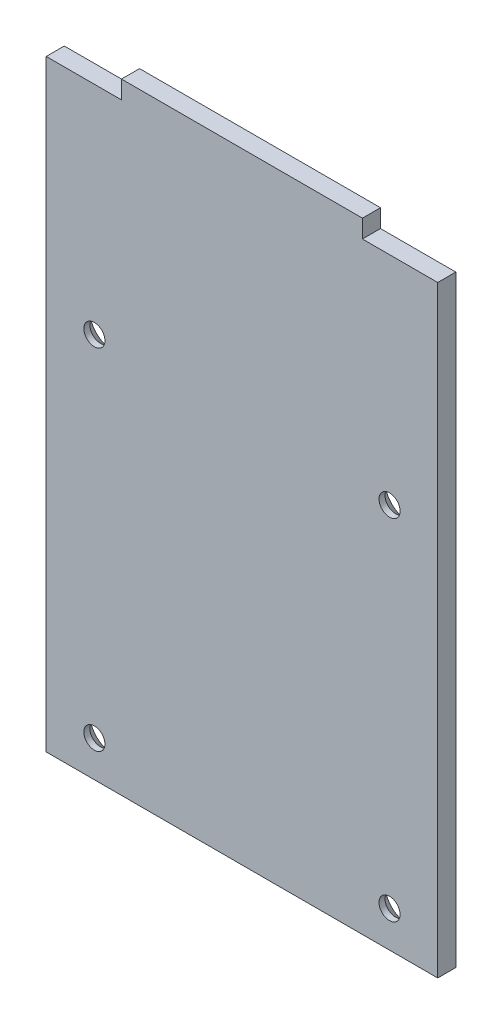
ISO-10303-21;
HEADER;
FILE_DESCRIPTION(('STEP AP214'),'2;1');
FILE_NAME('part.step','',(''),(''),'','','');
FILE_SCHEMA(('AUTOMOTIVE_DESIGN { 1 0 10303 214 1 1 1 1 }'));
ENDSEC;
DATA;
#1=APPLICATION_CONTEXT('core data for automotive mechanical design processes');
#2=APPLICATION_PROTOCOL_DEFINITION('international standard','automotive_design',2000,#1);
#3=PRODUCT_CONTEXT('',#1,'mechanical');
#4=PRODUCT('Part','Part','',(#3));
#5=PRODUCT_RELATED_PRODUCT_CATEGORY('part','',(#4));
#6=PRODUCT_DEFINITION_FORMATION('','',#4);
#7=PRODUCT_DEFINITION_CONTEXT('part definition',#1,'design');
#8=PRODUCT_DEFINITION('design','',#6,#7);
#9=PRODUCT_DEFINITION_SHAPE('','',#8);
#10=(LENGTH_UNIT() NAMED_UNIT(*) SI_UNIT(.MILLI.,.METRE.));
#11=(NAMED_UNIT(*) PLANE_ANGLE_UNIT() SI_UNIT($,.RADIAN.));
#12=(NAMED_UNIT(*) SI_UNIT($,.STERADIAN.) SOLID_ANGLE_UNIT());
#13=UNCERTAINTY_MEASURE_WITH_UNIT(LENGTH_MEASURE(1.E-05),#10,'distance_accuracy_value','');
#14=(GEOMETRIC_REPRESENTATION_CONTEXT(3) GLOBAL_UNCERTAINTY_ASSIGNED_CONTEXT((#13)) GLOBAL_UNIT_ASSIGNED_CONTEXT((#10,
#11,#12)) REPRESENTATION_CONTEXT('',''));
#15=CARTESIAN_POINT('',(0.,0.,0.));
#16=DIRECTION('',(0.,0.,1.));
#17=DIRECTION('',(1.,0.,0.));
#18=AXIS2_PLACEMENT_3D('',#15,#16,#17);
#19=CARTESIAN_POINT('',(0.,50.,3.));
#20=DIRECTION('',(0.,1.,0.));
#21=DIRECTION('',(0.,0.,1.));
#22=AXIS2_PLACEMENT_3D('',#19,#20,#21);
#23=PLANE('',#22);
#24=DIRECTION('',(1.,0.,0.));
#25=VECTOR('',#24,1.);
#26=CARTESIAN_POINT('',(0.,50.,0.));
#27=LINE('',#26,#25);
#28=CARTESIAN_POINT('',(20.,50.,0.));
#29=VERTEX_POINT('',#28);
#30=CARTESIAN_POINT('',(32.5,50.,0.));
#31=VERTEX_POINT('',#30);
#32=EDGE_CURVE('E140',#29,#31,#27,.T.);
#33=ORIENTED_EDGE('',*,*,#32,.F.);
#34=DIRECTION('',(0.,0.,-1.));
#35=VECTOR('',#34,1.);
#36=CARTESIAN_POINT('',(20.,50.,3.));
#37=LINE('',#36,#35);
#38=CARTESIAN_POINT('',(20.,50.,3.));
#39=VERTEX_POINT('',#38);
#40=EDGE_CURVE('E97',#39,#29,#37,.T.);
#41=ORIENTED_EDGE('',*,*,#40,.F.);
#42=DIRECTION('',(1.,0.,0.));
#43=VECTOR('',#42,1.);
#44=CARTESIAN_POINT('',(0.,50.,3.));
#45=LINE('',#44,#43);
#46=CARTESIAN_POINT('',(32.5,50.,3.));
#47=VERTEX_POINT('',#46);
#48=EDGE_CURVE('E135',#39,#47,#45,.T.);
#49=ORIENTED_EDGE('',*,*,#48,.T.);
#50=DIRECTION('',(0.,0.,-1.));
#51=VECTOR('',#50,1.);
#52=CARTESIAN_POINT('',(32.5,50.,3.));
#53=LINE('',#52,#51);
#54=EDGE_CURVE('E92',#47,#31,#53,.T.);
#55=ORIENTED_EDGE('',*,*,#54,.T.);
#56=EDGE_LOOP('',(#33,#41,#49,#55));
#57=FACE_BOUND('',#56,.T.);
#58=ADVANCED_FACE('F39',(#57),#23,.T.);
#59=CARTESIAN_POINT('',(20.,0.,3.));
#60=DIRECTION('',(-1.,0.,0.));
#61=DIRECTION('',(0.,0.,1.));
#62=AXIS2_PLACEMENT_3D('',#59,#60,#61);
#63=PLANE('',#62);
#64=DIRECTION('',(0.,1.,0.));
#65=VECTOR('',#64,1.);
#66=CARTESIAN_POINT('',(20.,0.,0.));
#67=LINE('',#66,#65);
#68=CARTESIAN_POINT('',(20.,53.,0.));
#69=VERTEX_POINT('',#68);
#70=EDGE_CURVE('E143',#29,#69,#67,.T.);
#71=ORIENTED_EDGE('',*,*,#70,.T.);
#72=DIRECTION('',(0.,0.,-1.));
#73=VECTOR('',#72,1.);
#74=CARTESIAN_POINT('',(20.,53.,3.));
#75=LINE('',#74,#73);
#76=CARTESIAN_POINT('',(20.,53.,3.));
#77=VERTEX_POINT('',#76);
#78=EDGE_CURVE('E165',#77,#69,#75,.T.);
#79=ORIENTED_EDGE('',*,*,#78,.F.);
#80=DIRECTION('',(0.,1.,0.));
#81=VECTOR('',#80,1.);
#82=CARTESIAN_POINT('',(20.,0.,3.));
#83=LINE('',#82,#81);
#84=EDGE_CURVE('E237',#39,#77,#83,.T.);
#85=ORIENTED_EDGE('',*,*,#84,.F.);
#86=ORIENTED_EDGE('',*,*,#40,.T.);
#87=EDGE_LOOP('',(#71,#79,#85,#86));
#88=FACE_BOUND('',#87,.T.);
#89=ADVANCED_FACE('F208',(#88),#63,.F.);
#90=CARTESIAN_POINT('',(0.,53.,3.));
#91=DIRECTION('',(0.,1.,0.));
#92=DIRECTION('',(0.,0.,1.));
#93=AXIS2_PLACEMENT_3D('',#90,#91,#92);
#94=PLANE('',#93);
#95=DIRECTION('',(1.,0.,0.));
#96=VECTOR('',#95,1.);
#97=CARTESIAN_POINT('',(0.,53.,0.));
#98=LINE('',#97,#96);
#99=CARTESIAN_POINT('',(-20.,53.,0.));
#100=VERTEX_POINT('',#99);
#101=EDGE_CURVE('E148',#100,#69,#98,.T.);
#102=ORIENTED_EDGE('',*,*,#101,.F.);
#103=DIRECTION('',(0.,0.,-1.));
#104=VECTOR('',#103,1.);
#105=CARTESIAN_POINT('',(-20.,53.,3.));
#106=LINE('',#105,#104);
#107=CARTESIAN_POINT('',(-20.,53.,3.));
#108=VERTEX_POINT('',#107);
#109=EDGE_CURVE('E163',#108,#100,#106,.T.);
#110=ORIENTED_EDGE('',*,*,#109,.F.);
#111=DIRECTION('',(1.,0.,0.));
#112=VECTOR('',#111,1.);
#113=CARTESIAN_POINT('',(0.,53.,3.));
#114=LINE('',#113,#112);
#115=EDGE_CURVE('E236',#108,#77,#114,.T.);
#116=ORIENTED_EDGE('',*,*,#115,.T.);
#117=ORIENTED_EDGE('',*,*,#78,.T.);
#118=EDGE_LOOP('',(#102,#110,#116,#117));
#119=FACE_BOUND('',#118,.T.);
#120=ADVANCED_FACE('F214',(#119),#94,.T.);
#121=CARTESIAN_POINT('',(-20.,0.,3.));
#122=DIRECTION('',(-1.,0.,0.));
#123=DIRECTION('',(0.,0.,1.));
#124=AXIS2_PLACEMENT_3D('',#121,#122,#123);
#125=PLANE('',#124);
#126=DIRECTION('',(0.,1.,0.));
#127=VECTOR('',#126,1.);
#128=CARTESIAN_POINT('',(-20.,0.,0.));
#129=LINE('',#128,#127);
#130=CARTESIAN_POINT('',(-20.,50.,0.));
#131=VERTEX_POINT('',#130);
#132=EDGE_CURVE('E151',#131,#100,#129,.T.);
#133=ORIENTED_EDGE('',*,*,#132,.F.);
#134=DIRECTION('',(0.,0.,-1.));
#135=VECTOR('',#134,1.);
#136=CARTESIAN_POINT('',(-20.,50.,3.));
#137=LINE('',#136,#135);
#138=CARTESIAN_POINT('',(-20.,50.,3.));
#139=VERTEX_POINT('',#138);
#140=EDGE_CURVE('E161',#139,#131,#137,.T.);
#141=ORIENTED_EDGE('',*,*,#140,.F.);
#142=DIRECTION('',(0.,1.,0.));
#143=VECTOR('',#142,1.);
#144=CARTESIAN_POINT('',(-20.,0.,3.));
#145=LINE('',#144,#143);
#146=EDGE_CURVE('E133',#139,#108,#145,.T.);
#147=ORIENTED_EDGE('',*,*,#146,.T.);
#148=ORIENTED_EDGE('',*,*,#109,.T.);
#149=EDGE_LOOP('',(#133,#141,#147,#148));
#150=FACE_BOUND('',#149,.T.);
#151=ADVANCED_FACE('F220',(#150),#125,.T.);
#152=CARTESIAN_POINT('',(-32.5,50.,0.));
#153=VERTEX_POINT('',#152);
#154=EDGE_CURVE('E145',#153,#131,#27,.T.);
#155=ORIENTED_EDGE('',*,*,#154,.F.);
#156=DIRECTION('',(0.,0.,-1.));
#157=VECTOR('',#156,1.);
#158=CARTESIAN_POINT('',(-32.5,50.,3.));
#159=LINE('',#158,#157);
#160=CARTESIAN_POINT('',(-32.5,50.,3.));
#161=VERTEX_POINT('',#160);
#162=EDGE_CURVE('E121',#161,#153,#159,.T.);
#163=ORIENTED_EDGE('',*,*,#162,.F.);
#164=EDGE_CURVE('E131',#161,#139,#45,.T.);
#165=ORIENTED_EDGE('',*,*,#164,.T.);
#166=ORIENTED_EDGE('',*,*,#140,.T.);
#167=EDGE_LOOP('',(#155,#163,#165,#166));
#168=FACE_BOUND('',#167,.T.);
#169=ADVANCED_FACE('F210',(#168),#23,.T.);
#170=CARTESIAN_POINT('',(-32.5,0.,3.));
#171=DIRECTION('',(-1.,0.,0.));
#172=DIRECTION('',(0.,0.,1.));
#173=AXIS2_PLACEMENT_3D('',#170,#171,#172);
#174=PLANE('',#173);
#175=DIRECTION('',(0.,1.,0.));
#176=VECTOR('',#175,1.);
#177=CARTESIAN_POINT('',(-32.5,0.,0.));
#178=LINE('',#177,#176);
#179=CARTESIAN_POINT('',(-32.5,-50.,0.));
#180=VERTEX_POINT('',#179);
#181=EDGE_CURVE('E120',#180,#153,#178,.T.);
#182=ORIENTED_EDGE('',*,*,#181,.F.);
#183=DIRECTION('',(0.,0.,-1.));
#184=VECTOR('',#183,1.);
#185=CARTESIAN_POINT('',(-32.5,-50.,3.));
#186=LINE('',#185,#184);
#187=CARTESIAN_POINT('',(-32.5,-50.,3.));
#188=VERTEX_POINT('',#187);
#189=EDGE_CURVE('E114',#188,#180,#186,.T.);
#190=ORIENTED_EDGE('',*,*,#189,.F.);
#191=DIRECTION('',(0.,1.,0.));
#192=VECTOR('',#191,1.);
#193=CARTESIAN_POINT('',(-32.5,0.,3.));
#194=LINE('',#193,#192);
#195=EDGE_CURVE('E118',#188,#161,#194,.T.);
#196=ORIENTED_EDGE('',*,*,#195,.T.);
#197=ORIENTED_EDGE('',*,*,#162,.T.);
#198=EDGE_LOOP('',(#182,#190,#196,#197));
#199=FACE_BOUND('',#198,.T.);
#200=ADVANCED_FACE('F116',(#199),#174,.T.);
#201=CARTESIAN_POINT('',(0.,-50.,3.));
#202=DIRECTION('',(0.,1.,0.));
#203=DIRECTION('',(0.,0.,1.));
#204=AXIS2_PLACEMENT_3D('',#201,#202,#203);
#205=PLANE('',#204);
#206=DIRECTION('',(1.,0.,0.));
#207=VECTOR('',#206,1.);
#208=CARTESIAN_POINT('',(0.,-50.,0.));
#209=LINE('',#208,#207);
#210=CARTESIAN_POINT('',(32.5,-50.,0.));
#211=VERTEX_POINT('',#210);
#212=EDGE_CURVE('E85',#180,#211,#209,.T.);
#213=ORIENTED_EDGE('',*,*,#212,.T.);
#214=DIRECTION('',(0.,0.,-1.));
#215=VECTOR('',#214,1.);
#216=CARTESIAN_POINT('',(32.5,-50.,3.));
#217=LINE('',#216,#215);
#218=CARTESIAN_POINT('',(32.5,-50.,3.));
#219=VERTEX_POINT('',#218);
#220=EDGE_CURVE('E122',#219,#211,#217,.T.);
#221=ORIENTED_EDGE('',*,*,#220,.F.);
#222=DIRECTION('',(1.,0.,0.));
#223=VECTOR('',#222,1.);
#224=CARTESIAN_POINT('',(0.,-50.,3.));
#225=LINE('',#224,#223);
#226=EDGE_CURVE('E124',#188,#219,#225,.T.);
#227=ORIENTED_EDGE('',*,*,#226,.F.);
#228=ORIENTED_EDGE('',*,*,#189,.T.);
#229=EDGE_LOOP('',(#213,#221,#227,#228));
#230=FACE_BOUND('',#229,.T.);
#231=ADVANCED_FACE('F125',(#230),#205,.F.);
#232=CARTESIAN_POINT('',(32.5,0.,3.));
#233=DIRECTION('',(-1.,0.,0.));
#234=DIRECTION('',(0.,0.,1.));
#235=AXIS2_PLACEMENT_3D('',#232,#233,#234);
#236=PLANE('',#235);
#237=DIRECTION('',(0.,1.,0.));
#238=VECTOR('',#237,1.);
#239=CARTESIAN_POINT('',(32.5,0.,0.));
#240=LINE('',#239,#238);
#241=EDGE_CURVE('E156',#211,#31,#240,.T.);
#242=ORIENTED_EDGE('',*,*,#241,.T.);
#243=ORIENTED_EDGE('',*,*,#54,.F.);
#244=DIRECTION('',(0.,1.,0.));
#245=VECTOR('',#244,1.);
#246=CARTESIAN_POINT('',(32.5,0.,3.));
#247=LINE('',#246,#245);
#248=EDGE_CURVE('E57',#219,#47,#247,.T.);
#249=ORIENTED_EDGE('',*,*,#248,.F.);
#250=ORIENTED_EDGE('',*,*,#220,.T.);
#251=EDGE_LOOP('',(#242,#243,#249,#250));
#252=FACE_BOUND('',#251,.T.);
#253=ADVANCED_FACE('F254',(#252),#236,.F.);
#254=CARTESIAN_POINT('',(0.,0.,3.));
#255=DIRECTION('',(0.,0.,1.));
#256=DIRECTION('',(1.,0.,0.));
#257=AXIS2_PLACEMENT_3D('',#254,#255,#256);
#258=PLANE('',#257);
#259=CARTESIAN_POINT('',(-24.5,-44.,3.));
#260=DIRECTION('',(0.,0.,1.));
#261=DIRECTION('',(1.,0.,0.));
#262=AXIS2_PLACEMENT_3D('',#259,#260,#261);
#263=CIRCLE('',#262,1.75);
#264=CARTESIAN_POINT('',(-22.75,-44.,3.));
#265=VERTEX_POINT('',#264);
#266=EDGE_CURVE('E243',#265,#265,#263,.T.);
#267=ORIENTED_EDGE('',*,*,#266,.F.);
#268=EDGE_LOOP('',(#267));
#269=FACE_BOUND('',#268,.T.);
#270=CARTESIAN_POINT('',(24.5,-44.,3.));
#271=DIRECTION('',(0.,0.,1.));
#272=DIRECTION('',(1.,0.,0.));
#273=AXIS2_PLACEMENT_3D('',#270,#271,#272);
#274=CIRCLE('',#273,1.75);
#275=CARTESIAN_POINT('',(26.25,-44.,3.));
#276=VERTEX_POINT('',#275);
#277=EDGE_CURVE('E246',#276,#276,#274,.T.);
#278=ORIENTED_EDGE('',*,*,#277,.F.);
#279=EDGE_LOOP('',(#278));
#280=FACE_BOUND('',#279,.T.);
#281=CARTESIAN_POINT('',(24.5,14.,3.));
#282=DIRECTION('',(0.,0.,1.));
#283=DIRECTION('',(1.,0.,0.));
#284=AXIS2_PLACEMENT_3D('',#281,#282,#283);
#285=CIRCLE('',#284,1.75);
#286=CARTESIAN_POINT('',(26.25,14.,3.));
#287=VERTEX_POINT('',#286);
#288=EDGE_CURVE('E242',#287,#287,#285,.T.);
#289=ORIENTED_EDGE('',*,*,#288,.F.);
#290=EDGE_LOOP('',(#289));
#291=FACE_BOUND('',#290,.T.);
#292=CARTESIAN_POINT('',(-24.5,14.,3.));
#293=DIRECTION('',(0.,0.,1.));
#294=DIRECTION('',(1.,0.,0.));
#295=AXIS2_PLACEMENT_3D('',#292,#293,#294);
#296=CIRCLE('',#295,1.75);
#297=CARTESIAN_POINT('',(-22.75,14.,3.));
#298=VERTEX_POINT('',#297);
#299=EDGE_CURVE('E144',#298,#298,#296,.T.);
#300=ORIENTED_EDGE('',*,*,#299,.F.);
#301=EDGE_LOOP('',(#300));
#302=FACE_BOUND('',#301,.T.);
#303=ORIENTED_EDGE('',*,*,#48,.F.);
#304=ORIENTED_EDGE('',*,*,#84,.T.);
#305=ORIENTED_EDGE('',*,*,#115,.F.);
#306=ORIENTED_EDGE('',*,*,#146,.F.);
#307=ORIENTED_EDGE('',*,*,#164,.F.);
#308=ORIENTED_EDGE('',*,*,#195,.F.);
#309=ORIENTED_EDGE('',*,*,#226,.T.);
#310=ORIENTED_EDGE('',*,*,#248,.T.);
#311=EDGE_LOOP('',(#303,#304,#305,#306,#307,#308,#309,#310));
#312=FACE_BOUND('',#311,.T.);
#313=ADVANCED_FACE('F128',(#269,#280,#291,#302,#312),#258,.T.);
#314=CARTESIAN_POINT('',(0.,0.,0.));
#315=DIRECTION('',(0.,0.,1.));
#316=DIRECTION('',(1.,0.,0.));
#317=AXIS2_PLACEMENT_3D('',#314,#315,#316);
#318=PLANE('',#317);
#319=CARTESIAN_POINT('',(-24.5,-44.,0.));
#320=DIRECTION('',(0.,0.,1.));
#321=DIRECTION('',(1.,0.,0.));
#322=AXIS2_PLACEMENT_3D('',#319,#320,#321);
#323=CIRCLE('',#322,3.74999999999999);
#324=CARTESIAN_POINT('',(-20.75,-44.,0.));
#325=VERTEX_POINT('',#324);
#326=EDGE_CURVE('E177',#325,#325,#323,.T.);
#327=ORIENTED_EDGE('',*,*,#326,.T.);
#328=EDGE_LOOP('',(#327));
#329=FACE_BOUND('',#328,.T.);
#330=CARTESIAN_POINT('',(-24.5,14.,0.));
#331=DIRECTION('',(0.,0.,1.));
#332=DIRECTION('',(1.,0.,0.));
#333=AXIS2_PLACEMENT_3D('',#330,#331,#332);
#334=CIRCLE('',#333,3.75);
#335=CARTESIAN_POINT('',(-20.75,14.,0.));
#336=VERTEX_POINT('',#335);
#337=EDGE_CURVE('E174',#336,#336,#334,.T.);
#338=ORIENTED_EDGE('',*,*,#337,.T.);
#339=EDGE_LOOP('',(#338));
#340=FACE_BOUND('',#339,.T.);
#341=CARTESIAN_POINT('',(24.5,14.,0.));
#342=DIRECTION('',(0.,0.,1.));
#343=DIRECTION('',(1.,0.,0.));
#344=AXIS2_PLACEMENT_3D('',#341,#342,#343);
#345=CIRCLE('',#344,3.74999999999999);
#346=CARTESIAN_POINT('',(28.25,14.,0.));
#347=VERTEX_POINT('',#346);
#348=EDGE_CURVE('E171',#347,#347,#345,.T.);
#349=ORIENTED_EDGE('',*,*,#348,.T.);
#350=EDGE_LOOP('',(#349));
#351=FACE_BOUND('',#350,.T.);
#352=CARTESIAN_POINT('',(24.5,-44.,0.));
#353=DIRECTION('',(0.,0.,1.));
#354=DIRECTION('',(1.,0.,0.));
#355=AXIS2_PLACEMENT_3D('',#352,#353,#354);
#356=CIRCLE('',#355,3.74999999999999);
#357=CARTESIAN_POINT('',(28.25,-44.,0.));
#358=VERTEX_POINT('',#357);
#359=EDGE_CURVE('E168',#358,#358,#356,.T.);
#360=ORIENTED_EDGE('',*,*,#359,.T.);
#361=EDGE_LOOP('',(#360));
#362=FACE_BOUND('',#361,.T.);
#363=ORIENTED_EDGE('',*,*,#32,.T.);
#364=ORIENTED_EDGE('',*,*,#241,.F.);
#365=ORIENTED_EDGE('',*,*,#212,.F.);
#366=ORIENTED_EDGE('',*,*,#181,.T.);
#367=ORIENTED_EDGE('',*,*,#154,.T.);
#368=ORIENTED_EDGE('',*,*,#132,.T.);
#369=ORIENTED_EDGE('',*,*,#101,.T.);
#370=ORIENTED_EDGE('',*,*,#70,.F.);
#371=EDGE_LOOP('',(#363,#364,#365,#366,#367,#368,#369,#370));
#372=FACE_BOUND('',#371,.T.);
#373=ADVANCED_FACE('F197',(#329,#340,#351,#362,#372),#318,.F.);
#374=CARTESIAN_POINT('',(-24.5,14.,-7.));
#375=DIRECTION('',(0.,0.,1.));
#376=DIRECTION('',(1.,0.,0.));
#377=AXIS2_PLACEMENT_3D('',#374,#375,#376);
#378=CYLINDRICAL_SURFACE('',#377,1.75);
#379=CARTESIAN_POINT('',(-24.5,14.,2.00000000000001));
#380=DIRECTION('',(0.,0.,1.));
#381=DIRECTION('',(1.,0.,0.));
#382=AXIS2_PLACEMENT_3D('',#379,#380,#381);
#383=CIRCLE('',#382,1.75);
#384=CARTESIAN_POINT('',(-22.75,14.,2.00000000000001));
#385=VERTEX_POINT('',#384);
#386=EDGE_CURVE('E183',#385,#385,#383,.F.);
#387=ORIENTED_EDGE('',*,*,#386,.T.);
#388=EDGE_LOOP('',(#387));
#389=FACE_BOUND('',#388,.T.);
#390=ORIENTED_EDGE('',*,*,#299,.T.);
#391=EDGE_LOOP('',(#390));
#392=FACE_BOUND('',#391,.T.);
#393=ADVANCED_FACE('F200',(#389,#392),#378,.F.);
#394=CARTESIAN_POINT('',(24.5,14.,-7.));
#395=DIRECTION('',(0.,0.,1.));
#396=DIRECTION('',(1.,0.,0.));
#397=AXIS2_PLACEMENT_3D('',#394,#395,#396);
#398=CYLINDRICAL_SURFACE('',#397,1.75);
#399=CARTESIAN_POINT('',(24.5,14.,2.));
#400=DIRECTION('',(0.,0.,1.));
#401=DIRECTION('',(1.,0.,0.));
#402=AXIS2_PLACEMENT_3D('',#399,#400,#401);
#403=CIRCLE('',#402,1.75);
#404=CARTESIAN_POINT('',(26.25,14.,2.));
#405=VERTEX_POINT('',#404);
#406=EDGE_CURVE('E49',#405,#405,#403,.F.);
#407=ORIENTED_EDGE('',*,*,#406,.T.);
#408=EDGE_LOOP('',(#407));
#409=FACE_BOUND('',#408,.T.);
#410=ORIENTED_EDGE('',*,*,#288,.T.);
#411=EDGE_LOOP('',(#410));
#412=FACE_BOUND('',#411,.T.);
#413=ADVANCED_FACE('F188',(#409,#412),#398,.F.);
#414=CARTESIAN_POINT('',(24.5,-44.,-7.));
#415=DIRECTION('',(0.,0.,1.));
#416=DIRECTION('',(1.,0.,0.));
#417=AXIS2_PLACEMENT_3D('',#414,#415,#416);
#418=CYLINDRICAL_SURFACE('',#417,1.75);
#419=CARTESIAN_POINT('',(24.5,-44.,2.));
#420=DIRECTION('',(0.,0.,1.));
#421=DIRECTION('',(1.,0.,0.));
#422=AXIS2_PLACEMENT_3D('',#419,#420,#421);
#423=CIRCLE('',#422,1.75);
#424=CARTESIAN_POINT('',(26.25,-44.,2.));
#425=VERTEX_POINT('',#424);
#426=EDGE_CURVE('E11',#425,#425,#423,.F.);
#427=ORIENTED_EDGE('',*,*,#426,.T.);
#428=EDGE_LOOP('',(#427));
#429=FACE_BOUND('',#428,.T.);
#430=ORIENTED_EDGE('',*,*,#277,.T.);
#431=EDGE_LOOP('',(#430));
#432=FACE_BOUND('',#431,.T.);
#433=ADVANCED_FACE('F265',(#429,#432),#418,.F.);
#434=CARTESIAN_POINT('',(-24.5,-44.,-7.));
#435=DIRECTION('',(0.,0.,1.));
#436=DIRECTION('',(1.,0.,0.));
#437=AXIS2_PLACEMENT_3D('',#434,#435,#436);
#438=CYLINDRICAL_SURFACE('',#437,1.75);
#439=CARTESIAN_POINT('',(-24.5,-44.,2.));
#440=DIRECTION('',(0.,0.,1.));
#441=DIRECTION('',(1.,0.,0.));
#442=AXIS2_PLACEMENT_3D('',#439,#440,#441);
#443=CIRCLE('',#442,1.75);
#444=CARTESIAN_POINT('',(-22.75,-44.,2.));
#445=VERTEX_POINT('',#444);
#446=EDGE_CURVE('E180',#445,#445,#443,.F.);
#447=ORIENTED_EDGE('',*,*,#446,.T.);
#448=EDGE_LOOP('',(#447));
#449=FACE_BOUND('',#448,.T.);
#450=ORIENTED_EDGE('',*,*,#266,.T.);
#451=EDGE_LOOP('',(#450));
#452=FACE_BOUND('',#451,.T.);
#453=ADVANCED_FACE('F268',(#449,#452),#438,.F.);
#454=CARTESIAN_POINT('',(-24.5,-44.,0.));
#455=DIRECTION('',(0.,0.,-1.));
#456=DIRECTION('',(-1.,0.,0.));
#457=AXIS2_PLACEMENT_3D('',#454,#455,#456);
#458=CONICAL_SURFACE('',#457,3.74999999999999,0.785398163397446);
#459=ORIENTED_EDGE('',*,*,#446,.F.);
#460=EDGE_LOOP('',(#459));
#461=FACE_BOUND('',#460,.T.);
#462=ORIENTED_EDGE('',*,*,#326,.F.);
#463=EDGE_LOOP('',(#462));
#464=FACE_BOUND('',#463,.T.);
#465=ADVANCED_FACE('F322',(#461,#464),#458,.F.);
#466=CARTESIAN_POINT('',(-24.5,14.,0.));
#467=DIRECTION('',(0.,0.,-1.));
#468=DIRECTION('',(-1.,0.,0.));
#469=AXIS2_PLACEMENT_3D('',#466,#467,#468);
#470=CONICAL_SURFACE('',#469,3.75,0.785398163397446);
#471=ORIENTED_EDGE('',*,*,#386,.F.);
#472=EDGE_LOOP('',(#471));
#473=FACE_BOUND('',#472,.T.);
#474=ORIENTED_EDGE('',*,*,#337,.F.);
#475=EDGE_LOOP('',(#474));
#476=FACE_BOUND('',#475,.T.);
#477=ADVANCED_FACE('F194',(#473,#476),#470,.F.);
#478=CARTESIAN_POINT('',(24.5,14.,0.));
#479=DIRECTION('',(0.,0.,-1.));
#480=DIRECTION('',(-1.,0.,0.));
#481=AXIS2_PLACEMENT_3D('',#478,#479,#480);
#482=CONICAL_SURFACE('',#481,3.74999999999999,0.785398163397446);
#483=ORIENTED_EDGE('',*,*,#406,.F.);
#484=EDGE_LOOP('',(#483));
#485=FACE_BOUND('',#484,.T.);
#486=ORIENTED_EDGE('',*,*,#348,.F.);
#487=EDGE_LOOP('',(#486));
#488=FACE_BOUND('',#487,.T.);
#489=ADVANCED_FACE('F191',(#485,#488),#482,.F.);
#490=CARTESIAN_POINT('',(24.5,-44.,0.));
#491=DIRECTION('',(0.,0.,-1.));
#492=DIRECTION('',(-1.,0.,0.));
#493=AXIS2_PLACEMENT_3D('',#490,#491,#492);
#494=CONICAL_SURFACE('',#493,3.74999999999999,0.785398163397446);
#495=ORIENTED_EDGE('',*,*,#426,.F.);
#496=EDGE_LOOP('',(#495));
#497=FACE_BOUND('',#496,.T.);
#498=ORIENTED_EDGE('',*,*,#359,.F.);
#499=EDGE_LOOP('',(#498));
#500=FACE_BOUND('',#499,.T.);
#501=ADVANCED_FACE('F42',(#497,#500),#494,.F.);
#502=CLOSED_SHELL('',(#58,#89,#120,#151,#169,#200,#231,#253,#313,#373,#393,#413,#433,#453,#465,
#477,#489,#501));
#503=MANIFOLD_SOLID_BREP('B2',#502);
#504=ADVANCED_BREP_SHAPE_REPRESENTATION('',(#18,#503),#14);
#505=SHAPE_DEFINITION_REPRESENTATION(#9,#504);
ENDSEC;
END-ISO-10303-21;
